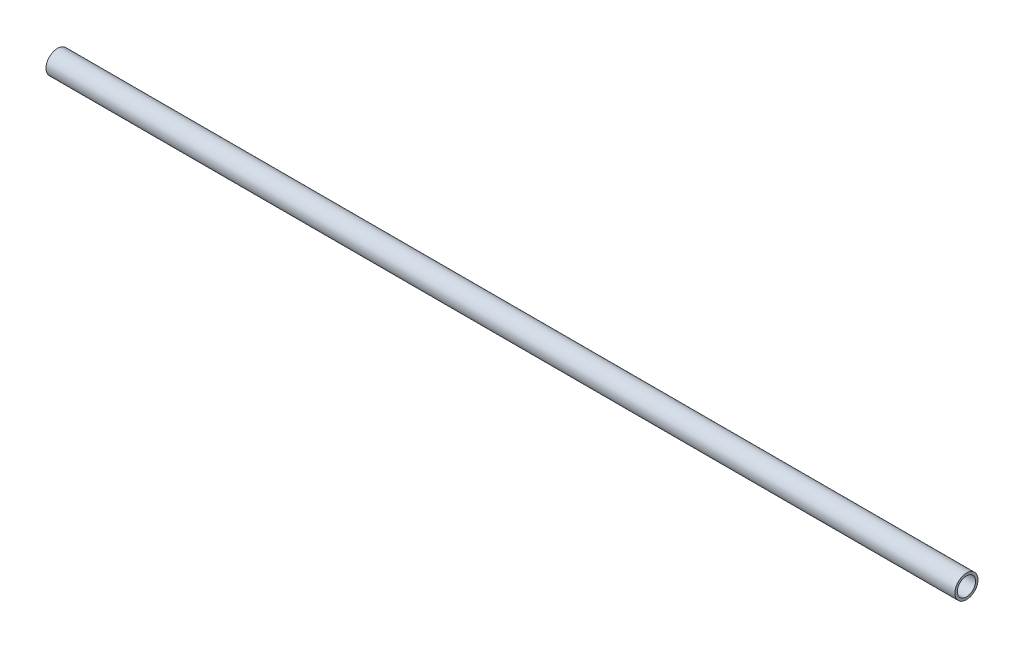
ISO-10303-21;
HEADER;
FILE_DESCRIPTION(('STEP AP214'),'2;1');
FILE_NAME('part.step','',(''),(''),'','','');
FILE_SCHEMA(('AUTOMOTIVE_DESIGN { 1 0 10303 214 1 1 1 1 }'));
ENDSEC;
DATA;
#1=APPLICATION_CONTEXT('core data for automotive mechanical design processes');
#2=APPLICATION_PROTOCOL_DEFINITION('international standard','automotive_design',2000,#1);
#3=PRODUCT_CONTEXT('',#1,'mechanical');
#4=PRODUCT('Part','Part','',(#3));
#5=PRODUCT_RELATED_PRODUCT_CATEGORY('part','',(#4));
#6=PRODUCT_DEFINITION_FORMATION('','',#4);
#7=PRODUCT_DEFINITION_CONTEXT('part definition',#1,'design');
#8=PRODUCT_DEFINITION('design','',#6,#7);
#9=PRODUCT_DEFINITION_SHAPE('','',#8);
#10=(LENGTH_UNIT() NAMED_UNIT(*) SI_UNIT(.MILLI.,.METRE.));
#11=(NAMED_UNIT(*) PLANE_ANGLE_UNIT() SI_UNIT($,.RADIAN.));
#12=(NAMED_UNIT(*) SI_UNIT($,.STERADIAN.) SOLID_ANGLE_UNIT());
#13=UNCERTAINTY_MEASURE_WITH_UNIT(LENGTH_MEASURE(1.E-05),#10,'distance_accuracy_value','');
#14=(GEOMETRIC_REPRESENTATION_CONTEXT(3) GLOBAL_UNCERTAINTY_ASSIGNED_CONTEXT((#13)) GLOBAL_UNIT_ASSIGNED_CONTEXT((#10,
#11,#12)) REPRESENTATION_CONTEXT('',''));
#15=CARTESIAN_POINT('',(0.,0.,0.));
#16=DIRECTION('',(0.,0.,1.));
#17=DIRECTION('',(1.,0.,0.));
#18=AXIS2_PLACEMENT_3D('',#15,#16,#17);
#19=CARTESIAN_POINT('',(500.,0.,0.));
#20=DIRECTION('',(1.,0.,0.));
#21=DIRECTION('',(0.,0.,-1.));
#22=AXIS2_PLACEMENT_3D('',#19,#20,#21);
#23=PLANE('',#22);
#24=CARTESIAN_POINT('',(500.,0.,0.));
#25=DIRECTION('',(1.,0.,0.));
#26=DIRECTION('',(0.,0.,-1.));
#27=AXIS2_PLACEMENT_3D('',#24,#25,#26);
#28=CIRCLE('',#27,6.35);
#29=CARTESIAN_POINT('',(500.,0.,-6.35));
#30=VERTEX_POINT('',#29);
#31=EDGE_CURVE('E10',#30,#30,#28,.T.);
#32=ORIENTED_EDGE('',*,*,#31,.T.);
#33=EDGE_LOOP('',(#32));
#34=FACE_BOUND('',#33,.T.);
#35=CARTESIAN_POINT('',(500.,0.,0.));
#36=DIRECTION('',(1.,0.,0.));
#37=DIRECTION('',(0.,0.,-1.));
#38=AXIS2_PLACEMENT_3D('',#35,#36,#37);
#39=CIRCLE('',#38,5.);
#40=CARTESIAN_POINT('',(500.,0.,-5.));
#41=VERTEX_POINT('',#40);
#42=EDGE_CURVE('E56',#41,#41,#39,.T.);
#43=ORIENTED_EDGE('',*,*,#42,.F.);
#44=EDGE_LOOP('',(#43));
#45=FACE_BOUND('',#44,.T.);
#46=ADVANCED_FACE('F43',(#34,#45),#23,.T.);
#47=CARTESIAN_POINT('',(0.,0.,0.));
#48=DIRECTION('',(1.,0.,0.));
#49=DIRECTION('',(0.,0.,-1.));
#50=AXIS2_PLACEMENT_3D('',#47,#48,#49);
#51=PLANE('',#50);
#52=CARTESIAN_POINT('',(0.,0.,0.));
#53=DIRECTION('',(1.,0.,0.));
#54=DIRECTION('',(0.,0.,-1.));
#55=AXIS2_PLACEMENT_3D('',#52,#53,#54);
#56=CIRCLE('',#55,6.35);
#57=CARTESIAN_POINT('',(0.,0.,-6.35));
#58=VERTEX_POINT('',#57);
#59=EDGE_CURVE('E47',#58,#58,#56,.T.);
#60=ORIENTED_EDGE('',*,*,#59,.F.);
#61=EDGE_LOOP('',(#60));
#62=FACE_BOUND('',#61,.T.);
#63=CARTESIAN_POINT('',(0.,0.,0.));
#64=DIRECTION('',(1.,0.,0.));
#65=DIRECTION('',(0.,0.,-1.));
#66=AXIS2_PLACEMENT_3D('',#63,#64,#65);
#67=CIRCLE('',#66,5.);
#68=CARTESIAN_POINT('',(0.,0.,-5.));
#69=VERTEX_POINT('',#68);
#70=EDGE_CURVE('E58',#69,#69,#67,.T.);
#71=ORIENTED_EDGE('',*,*,#70,.T.);
#72=EDGE_LOOP('',(#71));
#73=FACE_BOUND('',#72,.T.);
#74=ADVANCED_FACE('F70',(#62,#73),#51,.F.);
#75=CARTESIAN_POINT('',(500.,0.,0.));
#76=DIRECTION('',(-1.,0.,0.));
#77=DIRECTION('',(0.,0.,1.));
#78=AXIS2_PLACEMENT_3D('',#75,#76,#77);
#79=CYLINDRICAL_SURFACE('',#78,6.35);
#80=ORIENTED_EDGE('',*,*,#31,.F.);
#81=EDGE_LOOP('',(#80));
#82=FACE_BOUND('',#81,.T.);
#83=ORIENTED_EDGE('',*,*,#59,.T.);
#84=EDGE_LOOP('',(#83));
#85=FACE_BOUND('',#84,.T.);
#86=ADVANCED_FACE('F45',(#82,#85),#79,.T.);
#87=CARTESIAN_POINT('',(500.,0.,0.));
#88=DIRECTION('',(-1.,0.,0.));
#89=DIRECTION('',(0.,0.,1.));
#90=AXIS2_PLACEMENT_3D('',#87,#88,#89);
#91=CYLINDRICAL_SURFACE('',#90,5.);
#92=ORIENTED_EDGE('',*,*,#42,.T.);
#93=EDGE_LOOP('',(#92));
#94=FACE_BOUND('',#93,.T.);
#95=ORIENTED_EDGE('',*,*,#70,.F.);
#96=EDGE_LOOP('',(#95));
#97=FACE_BOUND('',#96,.T.);
#98=ADVANCED_FACE('F66',(#94,#97),#91,.F.);
#99=CLOSED_SHELL('',(#46,#74,#86,#98));
#100=MANIFOLD_SOLID_BREP('B2',#99);
#101=ADVANCED_BREP_SHAPE_REPRESENTATION('',(#18,#100),#14);
#102=SHAPE_DEFINITION_REPRESENTATION(#9,#101);
ENDSEC;
END-ISO-10303-21;
